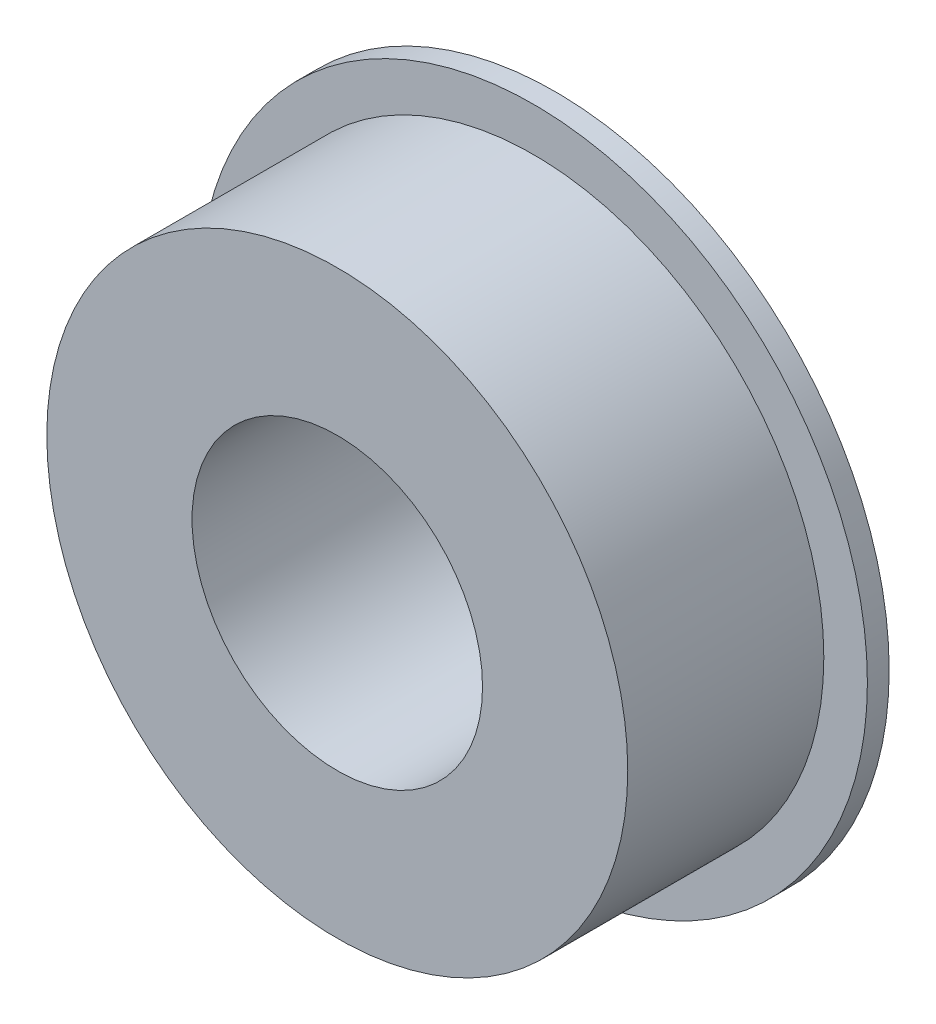
ISO-10303-21;
HEADER;
FILE_DESCRIPTION(('STEP AP214'),'2;1');
FILE_NAME('part.step','',(''),(''),'','','');
FILE_SCHEMA(('AUTOMOTIVE_DESIGN { 1 0 10303 214 1 1 1 1 }'));
ENDSEC;
DATA;
#1=APPLICATION_CONTEXT('core data for automotive mechanical design processes');
#2=APPLICATION_PROTOCOL_DEFINITION('international standard','automotive_design',2000,#1);
#3=PRODUCT_CONTEXT('',#1,'mechanical');
#4=PRODUCT('Part','Part','',(#3));
#5=PRODUCT_RELATED_PRODUCT_CATEGORY('part','',(#4));
#6=PRODUCT_DEFINITION_FORMATION('','',#4);
#7=PRODUCT_DEFINITION_CONTEXT('part definition',#1,'design');
#8=PRODUCT_DEFINITION('design','',#6,#7);
#9=PRODUCT_DEFINITION_SHAPE('','',#8);
#10=(LENGTH_UNIT() NAMED_UNIT(*) SI_UNIT(.MILLI.,.METRE.));
#11=(NAMED_UNIT(*) PLANE_ANGLE_UNIT() SI_UNIT($,.RADIAN.));
#12=(NAMED_UNIT(*) SI_UNIT($,.STERADIAN.) SOLID_ANGLE_UNIT());
#13=UNCERTAINTY_MEASURE_WITH_UNIT(LENGTH_MEASURE(1.E-05),#10,'distance_accuracy_value','');
#14=(GEOMETRIC_REPRESENTATION_CONTEXT(3) GLOBAL_UNCERTAINTY_ASSIGNED_CONTEXT((#13)) GLOBAL_UNIT_ASSIGNED_CONTEXT((#10,
#11,#12)) REPRESENTATION_CONTEXT('',''));
#15=CARTESIAN_POINT('',(0.,0.,0.));
#16=DIRECTION('',(0.,0.,1.));
#17=DIRECTION('',(1.,0.,0.));
#18=AXIS2_PLACEMENT_3D('',#15,#16,#17);
#19=CARTESIAN_POINT('',(0.,0.,3.));
#20=DIRECTION('',(0.,0.,-1.));
#21=DIRECTION('',(-1.,0.,0.));
#22=AXIS2_PLACEMENT_3D('',#19,#20,#21);
#23=PLANE('',#22);
#24=CARTESIAN_POINT('',(0.,0.,3.));
#25=DIRECTION('',(0.,0.,1.));
#26=DIRECTION('',(1.,0.,0.));
#27=AXIS2_PLACEMENT_3D('',#24,#25,#26);
#28=CIRCLE('',#27,1.99999999999999);
#29=CARTESIAN_POINT('',(1.99999999999999,0.,3.));
#30=VERTEX_POINT('',#29);
#31=EDGE_CURVE('E52',#30,#30,#28,.T.);
#32=ORIENTED_EDGE('',*,*,#31,.F.);
#33=EDGE_LOOP('',(#32));
#34=FACE_BOUND('',#33,.T.);
#35=CARTESIAN_POINT('',(0.,0.,3.));
#36=DIRECTION('',(0.,0.,1.));
#37=DIRECTION('',(1.,0.,0.));
#38=AXIS2_PLACEMENT_3D('',#35,#36,#37);
#39=CIRCLE('',#38,4.);
#40=CARTESIAN_POINT('',(4.,0.,3.));
#41=VERTEX_POINT('',#40);
#42=EDGE_CURVE('E10',#41,#41,#39,.T.);
#43=ORIENTED_EDGE('',*,*,#42,.T.);
#44=EDGE_LOOP('',(#43));
#45=FACE_BOUND('',#44,.T.);
#46=ADVANCED_FACE('F30',(#34,#45),#23,.F.);
#47=CARTESIAN_POINT('',(0.,0.,55.));
#48=DIRECTION('',(0.,0.,1.));
#49=DIRECTION('',(1.,0.,0.));
#50=AXIS2_PLACEMENT_3D('',#47,#48,#49);
#51=CYLINDRICAL_SURFACE('',#50,4.);
#52=ORIENTED_EDGE('',*,*,#42,.F.);
#53=EDGE_LOOP('',(#52));
#54=FACE_BOUND('',#53,.T.);
#55=CARTESIAN_POINT('',(0.,0.,0.300000000000002));
#56=DIRECTION('',(0.,0.,1.));
#57=DIRECTION('',(1.,0.,0.));
#58=AXIS2_PLACEMENT_3D('',#55,#56,#57);
#59=CIRCLE('',#58,4.);
#60=CARTESIAN_POINT('',(4.,0.,0.300000000000002));
#61=VERTEX_POINT('',#60);
#62=EDGE_CURVE('E36',#61,#61,#59,.T.);
#63=ORIENTED_EDGE('',*,*,#62,.T.);
#64=EDGE_LOOP('',(#63));
#65=FACE_BOUND('',#64,.T.);
#66=ADVANCED_FACE('F60',(#54,#65),#51,.T.);
#67=CARTESIAN_POINT('',(0.,4.,0.3));
#68=DIRECTION('',(0.,0.,-1.));
#69=DIRECTION('',(-1.,0.,0.));
#70=AXIS2_PLACEMENT_3D('',#67,#68,#69);
#71=PLANE('',#70);
#72=ORIENTED_EDGE('',*,*,#62,.F.);
#73=EDGE_LOOP('',(#72));
#74=FACE_BOUND('',#73,.T.);
#75=CARTESIAN_POINT('',(0.,0.,0.300000000000002));
#76=DIRECTION('',(0.,0.,1.));
#77=DIRECTION('',(1.,0.,0.));
#78=AXIS2_PLACEMENT_3D('',#75,#76,#77);
#79=CIRCLE('',#78,4.6);
#80=CARTESIAN_POINT('',(4.6,0.,0.300000000000002));
#81=VERTEX_POINT('',#80);
#82=EDGE_CURVE('E40',#81,#81,#79,.T.);
#83=ORIENTED_EDGE('',*,*,#82,.T.);
#84=EDGE_LOOP('',(#83));
#85=FACE_BOUND('',#84,.T.);
#86=ADVANCED_FACE('F64',(#74,#85),#71,.F.);
#87=CARTESIAN_POINT('',(0.,0.,55.));
#88=DIRECTION('',(0.,0.,1.));
#89=DIRECTION('',(1.,0.,0.));
#90=AXIS2_PLACEMENT_3D('',#87,#88,#89);
#91=CYLINDRICAL_SURFACE('',#90,4.6);
#92=ORIENTED_EDGE('',*,*,#82,.F.);
#93=EDGE_LOOP('',(#92));
#94=FACE_BOUND('',#93,.T.);
#95=CARTESIAN_POINT('',(0.,0.,0.));
#96=DIRECTION('',(0.,0.,1.));
#97=DIRECTION('',(1.,0.,0.));
#98=AXIS2_PLACEMENT_3D('',#95,#96,#97);
#99=CIRCLE('',#98,4.6);
#100=CARTESIAN_POINT('',(4.6,0.,0.));
#101=VERTEX_POINT('',#100);
#102=EDGE_CURVE('E44',#101,#101,#99,.T.);
#103=ORIENTED_EDGE('',*,*,#102,.T.);
#104=EDGE_LOOP('',(#103));
#105=FACE_BOUND('',#104,.T.);
#106=ADVANCED_FACE('F69',(#94,#105),#91,.T.);
#107=CARTESIAN_POINT('',(0.,0.,0.));
#108=DIRECTION('',(0.,0.,1.));
#109=DIRECTION('',(1.,0.,0.));
#110=AXIS2_PLACEMENT_3D('',#107,#108,#109);
#111=PLANE('',#110);
#112=CARTESIAN_POINT('',(0.,0.,0.));
#113=DIRECTION('',(0.,0.,1.));
#114=DIRECTION('',(1.,0.,0.));
#115=AXIS2_PLACEMENT_3D('',#112,#113,#114);
#116=CIRCLE('',#115,1.99999999999999);
#117=CARTESIAN_POINT('',(1.99999999999999,0.,0.));
#118=VERTEX_POINT('',#117);
#119=EDGE_CURVE('E49',#118,#118,#116,.T.);
#120=ORIENTED_EDGE('',*,*,#119,.T.);
#121=EDGE_LOOP('',(#120));
#122=FACE_BOUND('',#121,.T.);
#123=ORIENTED_EDGE('',*,*,#102,.F.);
#124=EDGE_LOOP('',(#123));
#125=FACE_BOUND('',#124,.T.);
#126=ADVANCED_FACE('F75',(#122,#125),#111,.F.);
#127=CARTESIAN_POINT('',(0.,0.,3.));
#128=DIRECTION('',(0.,0.,1.));
#129=DIRECTION('',(1.,0.,0.));
#130=AXIS2_PLACEMENT_3D('',#127,#128,#129);
#131=CYLINDRICAL_SURFACE('',#130,1.99999999999999);
#132=ORIENTED_EDGE('',*,*,#31,.T.);
#133=EDGE_LOOP('',(#132));
#134=FACE_BOUND('',#133,.T.);
#135=ORIENTED_EDGE('',*,*,#119,.F.);
#136=EDGE_LOOP('',(#135));
#137=FACE_BOUND('',#136,.T.);
#138=ADVANCED_FACE('F56',(#134,#137),#131,.F.);
#139=CLOSED_SHELL('',(#46,#66,#86,#106,#126,#138));
#140=MANIFOLD_SOLID_BREP('B2',#139);
#141=ADVANCED_BREP_SHAPE_REPRESENTATION('',(#18,#140),#14);
#142=SHAPE_DEFINITION_REPRESENTATION(#9,#141);
ENDSEC;
END-ISO-10303-21;
